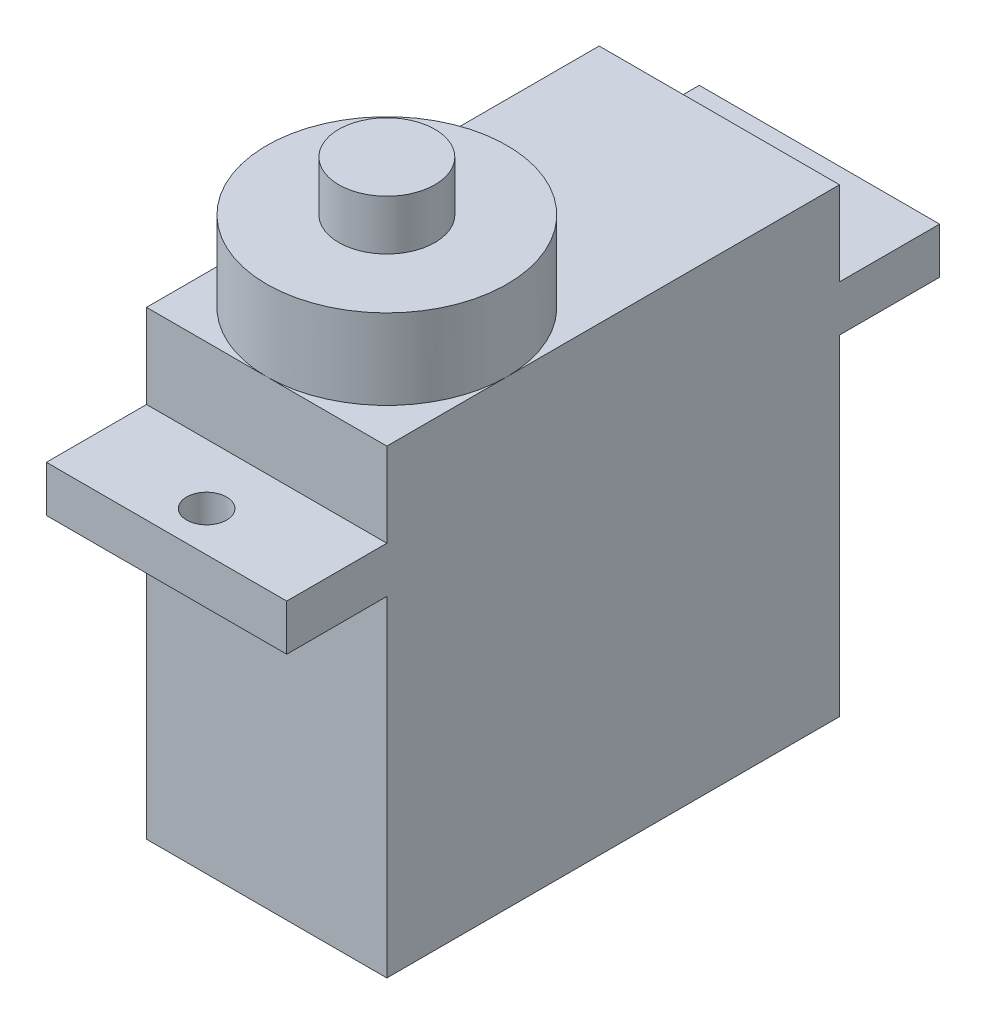
ISO-10303-21;
HEADER;
FILE_DESCRIPTION(('STEP AP214'),'2;1');
FILE_NAME('part.step','',(''),(''),'','','');
FILE_SCHEMA(('AUTOMOTIVE_DESIGN { 1 0 10303 214 1 1 1 1 }'));
ENDSEC;
DATA;
#1=APPLICATION_CONTEXT('core data for automotive mechanical design processes');
#2=APPLICATION_PROTOCOL_DEFINITION('international standard','automotive_design',2000,#1);
#3=PRODUCT_CONTEXT('',#1,'mechanical');
#4=PRODUCT('Part','Part','',(#3));
#5=PRODUCT_RELATED_PRODUCT_CATEGORY('part','',(#4));
#6=PRODUCT_DEFINITION_FORMATION('','',#4);
#7=PRODUCT_DEFINITION_CONTEXT('part definition',#1,'design');
#8=PRODUCT_DEFINITION('design','',#6,#7);
#9=PRODUCT_DEFINITION_SHAPE('','',#8);
#10=(LENGTH_UNIT() NAMED_UNIT(*) SI_UNIT(.MILLI.,.METRE.));
#11=(NAMED_UNIT(*) PLANE_ANGLE_UNIT() SI_UNIT($,.RADIAN.));
#12=(NAMED_UNIT(*) SI_UNIT($,.STERADIAN.) SOLID_ANGLE_UNIT());
#13=UNCERTAINTY_MEASURE_WITH_UNIT(LENGTH_MEASURE(1.E-05),#10,'distance_accuracy_value','');
#14=(GEOMETRIC_REPRESENTATION_CONTEXT(3) GLOBAL_UNCERTAINTY_ASSIGNED_CONTEXT((#13)) GLOBAL_UNIT_ASSIGNED_CONTEXT((#10,
#11,#12)) REPRESENTATION_CONTEXT('',''));
#15=CARTESIAN_POINT('',(0.,0.,0.));
#16=DIRECTION('',(0.,0.,1.));
#17=DIRECTION('',(1.,0.,0.));
#18=AXIS2_PLACEMENT_3D('',#15,#16,#17);
#19=CARTESIAN_POINT('',(12.,0.,-22.6));
#20=DIRECTION('',(0.,0.,1.));
#21=DIRECTION('',(1.,0.,0.));
#22=AXIS2_PLACEMENT_3D('',#19,#20,#21);
#23=PLANE('',#22);
#24=DIRECTION('',(1.,0.,0.));
#25=VECTOR('',#24,1.);
#26=CARTESIAN_POINT('',(0.,18.8,-22.6));
#27=LINE('',#26,#25);
#28=CARTESIAN_POINT('',(0.,18.8,-22.6));
#29=VERTEX_POINT('',#28);
#30=CARTESIAN_POINT('',(12.,18.8,-22.6));
#31=VERTEX_POINT('',#30);
#32=EDGE_CURVE('E60',#29,#31,#27,.T.);
#33=ORIENTED_EDGE('',*,*,#32,.F.);
#34=DIRECTION('',(0.,1.,0.));
#35=VECTOR('',#34,1.);
#36=CARTESIAN_POINT('',(0.,0.,-22.6));
#37=LINE('',#36,#35);
#38=CARTESIAN_POINT('',(0.,23.,-22.6));
#39=VERTEX_POINT('',#38);
#40=EDGE_CURVE('E236',#29,#39,#37,.T.);
#41=ORIENTED_EDGE('',*,*,#40,.T.);
#42=DIRECTION('',(-1.,0.,0.));
#43=VECTOR('',#42,1.);
#44=CARTESIAN_POINT('',(12.,23.,-22.6));
#45=LINE('',#44,#43);
#46=CARTESIAN_POINT('',(12.,23.,-22.6));
#47=VERTEX_POINT('',#46);
#48=EDGE_CURVE('E136',#47,#39,#45,.T.);
#49=ORIENTED_EDGE('',*,*,#48,.F.);
#50=DIRECTION('',(0.,1.,0.));
#51=VECTOR('',#50,1.);
#52=CARTESIAN_POINT('',(12.,0.,-22.6));
#53=LINE('',#52,#51);
#54=EDGE_CURVE('E134',#31,#47,#53,.T.);
#55=ORIENTED_EDGE('',*,*,#54,.F.);
#56=EDGE_LOOP('',(#33,#41,#49,#55));
#57=FACE_BOUND('',#56,.T.);
#58=ADVANCED_FACE('F34',(#57),#23,.F.);
#59=CARTESIAN_POINT('',(12.,0.,0.));
#60=DIRECTION('',(0.,0.,-1.));
#61=DIRECTION('',(-1.,0.,0.));
#62=AXIS2_PLACEMENT_3D('',#59,#60,#61);
#63=PLANE('',#62);
#64=DIRECTION('',(-1.,0.,0.));
#65=VECTOR('',#64,1.);
#66=CARTESIAN_POINT('',(12.,18.8,0.));
#67=LINE('',#66,#65);
#68=CARTESIAN_POINT('',(12.,18.8,0.));
#69=VERTEX_POINT('',#68);
#70=CARTESIAN_POINT('',(0.,18.8,0.));
#71=VERTEX_POINT('',#70);
#72=EDGE_CURVE('E191',#69,#71,#67,.T.);
#73=ORIENTED_EDGE('',*,*,#72,.F.);
#74=DIRECTION('',(0.,-1.,0.));
#75=VECTOR('',#74,1.);
#76=CARTESIAN_POINT('',(12.,0.,0.));
#77=LINE('',#76,#75);
#78=CARTESIAN_POINT('',(12.,23.,0.));
#79=VERTEX_POINT('',#78);
#80=EDGE_CURVE('E224',#79,#69,#77,.T.);
#81=ORIENTED_EDGE('',*,*,#80,.F.);
#82=DIRECTION('',(-1.,0.,0.));
#83=VECTOR('',#82,1.);
#84=CARTESIAN_POINT('',(12.,23.,0.));
#85=LINE('',#84,#83);
#86=CARTESIAN_POINT('',(6.,23.,0.));
#87=VERTEX_POINT('',#86);
#88=EDGE_CURVE('E250',#79,#87,#85,.T.);
#89=ORIENTED_EDGE('',*,*,#88,.T.);
#90=CARTESIAN_POINT('',(0.,23.,0.));
#91=VERTEX_POINT('',#90);
#92=EDGE_CURVE('E252',#87,#91,#85,.T.);
#93=ORIENTED_EDGE('',*,*,#92,.T.);
#94=DIRECTION('',(0.,-1.,0.));
#95=VECTOR('',#94,1.);
#96=CARTESIAN_POINT('',(0.,0.,0.));
#97=LINE('',#96,#95);
#98=EDGE_CURVE('E275',#91,#71,#97,.T.);
#99=ORIENTED_EDGE('',*,*,#98,.T.);
#100=EDGE_LOOP('',(#73,#81,#89,#93,#99));
#101=FACE_BOUND('',#100,.T.);
#102=ADVANCED_FACE('F285',(#101),#63,.F.);
#103=CARTESIAN_POINT('',(12.,23.,0.));
#104=DIRECTION('',(0.,-1.,0.));
#105=DIRECTION('',(0.,0.,-1.));
#106=AXIS2_PLACEMENT_3D('',#103,#104,#105);
#107=PLANE('',#106);
#108=CARTESIAN_POINT('',(6.,23.,-6.));
#109=DIRECTION('',(0.,1.,0.));
#110=DIRECTION('',(0.,0.,1.));
#111=AXIS2_PLACEMENT_3D('',#108,#109,#110);
#112=CIRCLE('',#111,6.);
#113=CARTESIAN_POINT('',(12.,23.,-6.));
#114=VERTEX_POINT('',#113);
#115=EDGE_CURVE('E45',#87,#114,#112,.T.);
#116=ORIENTED_EDGE('',*,*,#115,.F.);
#117=ORIENTED_EDGE('',*,*,#88,.F.);
#118=DIRECTION('',(0.,0.,1.));
#119=VECTOR('',#118,1.);
#120=CARTESIAN_POINT('',(12.,23.,0.));
#121=LINE('',#120,#119);
#122=EDGE_CURVE('E235',#114,#79,#121,.T.);
#123=ORIENTED_EDGE('',*,*,#122,.F.);
#124=EDGE_LOOP('',(#116,#117,#123));
#125=FACE_BOUND('',#124,.T.);
#126=ADVANCED_FACE('F283',(#125),#107,.F.);
#127=CARTESIAN_POINT('',(0.,23.,-6.));
#128=VERTEX_POINT('',#127);
#129=EDGE_CURVE('E11',#114,#128,#112,.T.);
#130=ORIENTED_EDGE('',*,*,#129,.F.);
#131=EDGE_CURVE('E230',#47,#114,#121,.T.);
#132=ORIENTED_EDGE('',*,*,#131,.F.);
#133=ORIENTED_EDGE('',*,*,#48,.T.);
#134=DIRECTION('',(0.,0.,1.));
#135=VECTOR('',#134,1.);
#136=CARTESIAN_POINT('',(0.,23.,0.));
#137=LINE('',#136,#135);
#138=EDGE_CURVE('E245',#39,#128,#137,.T.);
#139=ORIENTED_EDGE('',*,*,#138,.T.);
#140=EDGE_LOOP('',(#130,#132,#133,#139));
#141=FACE_BOUND('',#140,.T.);
#142=ADVANCED_FACE('F277',(#141),#107,.F.);
#143=CARTESIAN_POINT('',(12.,16.5,0.));
#144=VERTEX_POINT('',#143);
#145=CARTESIAN_POINT('',(12.,0.,0.));
#146=VERTEX_POINT('',#145);
#147=EDGE_CURVE('E226',#144,#146,#77,.T.);
#148=ORIENTED_EDGE('',*,*,#147,.F.);
#149=DIRECTION('',(-1.,0.,0.));
#150=VECTOR('',#149,1.);
#151=CARTESIAN_POINT('',(12.,16.5,0.));
#152=LINE('',#151,#150);
#153=CARTESIAN_POINT('',(0.,16.5,0.));
#154=VERTEX_POINT('',#153);
#155=EDGE_CURVE('E202',#144,#154,#152,.T.);
#156=ORIENTED_EDGE('',*,*,#155,.T.);
#157=CARTESIAN_POINT('',(0.,0.,0.));
#158=VERTEX_POINT('',#157);
#159=EDGE_CURVE('E221',#154,#158,#97,.T.);
#160=ORIENTED_EDGE('',*,*,#159,.T.);
#161=DIRECTION('',(-1.,0.,0.));
#162=VECTOR('',#161,1.);
#163=CARTESIAN_POINT('',(12.,0.,0.));
#164=LINE('',#163,#162);
#165=EDGE_CURVE('E256',#146,#158,#164,.T.);
#166=ORIENTED_EDGE('',*,*,#165,.F.);
#167=EDGE_LOOP('',(#148,#156,#160,#166));
#168=FACE_BOUND('',#167,.T.);
#169=ADVANCED_FACE('F36',(#168),#63,.F.);
#170=CARTESIAN_POINT('',(12.,0.,0.));
#171=DIRECTION('',(0.,1.,0.));
#172=DIRECTION('',(0.,0.,1.));
#173=AXIS2_PLACEMENT_3D('',#170,#171,#172);
#174=PLANE('',#173);
#175=DIRECTION('',(0.,0.,-1.));
#176=VECTOR('',#175,1.);
#177=CARTESIAN_POINT('',(0.,0.,0.));
#178=LINE('',#177,#176);
#179=CARTESIAN_POINT('',(0.,0.,-22.6));
#180=VERTEX_POINT('',#179);
#181=EDGE_CURVE('E240',#158,#180,#178,.T.);
#182=ORIENTED_EDGE('',*,*,#181,.T.);
#183=DIRECTION('',(-1.,0.,0.));
#184=VECTOR('',#183,1.);
#185=CARTESIAN_POINT('',(12.,0.,-22.6));
#186=LINE('',#185,#184);
#187=CARTESIAN_POINT('',(12.,0.,-22.6));
#188=VERTEX_POINT('',#187);
#189=EDGE_CURVE('E254',#188,#180,#186,.T.);
#190=ORIENTED_EDGE('',*,*,#189,.F.);
#191=DIRECTION('',(0.,0.,-1.));
#192=VECTOR('',#191,1.);
#193=CARTESIAN_POINT('',(12.,0.,0.));
#194=LINE('',#193,#192);
#195=EDGE_CURVE('E142',#146,#188,#194,.T.);
#196=ORIENTED_EDGE('',*,*,#195,.F.);
#197=ORIENTED_EDGE('',*,*,#165,.T.);
#198=EDGE_LOOP('',(#182,#190,#196,#197));
#199=FACE_BOUND('',#198,.T.);
#200=ADVANCED_FACE('F304',(#199),#174,.F.);
#201=CARTESIAN_POINT('',(0.,16.5,-22.6));
#202=VERTEX_POINT('',#201);
#203=EDGE_CURVE('E239',#180,#202,#37,.T.);
#204=ORIENTED_EDGE('',*,*,#203,.T.);
#205=DIRECTION('',(1.,0.,0.));
#206=VECTOR('',#205,1.);
#207=CARTESIAN_POINT('',(0.,16.5,-22.6));
#208=LINE('',#207,#206);
#209=CARTESIAN_POINT('',(12.,16.5,-22.6));
#210=VERTEX_POINT('',#209);
#211=EDGE_CURVE('E52',#202,#210,#208,.T.);
#212=ORIENTED_EDGE('',*,*,#211,.T.);
#213=EDGE_CURVE('E141',#188,#210,#53,.T.);
#214=ORIENTED_EDGE('',*,*,#213,.F.);
#215=ORIENTED_EDGE('',*,*,#189,.T.);
#216=EDGE_LOOP('',(#204,#212,#214,#215));
#217=FACE_BOUND('',#216,.T.);
#218=ADVANCED_FACE('F306',(#217),#23,.F.);
#219=EDGE_CURVE('E43',#128,#87,#112,.T.);
#220=ORIENTED_EDGE('',*,*,#219,.F.);
#221=EDGE_CURVE('E249',#128,#91,#137,.T.);
#222=ORIENTED_EDGE('',*,*,#221,.T.);
#223=ORIENTED_EDGE('',*,*,#92,.F.);
#224=EDGE_LOOP('',(#220,#222,#223));
#225=FACE_BOUND('',#224,.T.);
#226=ADVANCED_FACE('F269',(#225),#107,.F.);
#227=CARTESIAN_POINT('',(12.,0.,0.));
#228=DIRECTION('',(-1.,0.,0.));
#229=DIRECTION('',(0.,0.,1.));
#230=AXIS2_PLACEMENT_3D('',#227,#228,#229);
#231=PLANE('',#230);
#232=ORIENTED_EDGE('',*,*,#80,.T.);
#233=DIRECTION('',(0.,0.,-1.));
#234=VECTOR('',#233,1.);
#235=CARTESIAN_POINT('',(12.,18.8,0.));
#236=LINE('',#235,#234);
#237=CARTESIAN_POINT('',(12.,18.8,5.));
#238=VERTEX_POINT('',#237);
#239=EDGE_CURVE('E188',#238,#69,#236,.T.);
#240=ORIENTED_EDGE('',*,*,#239,.F.);
#241=DIRECTION('',(0.,-1.,0.));
#242=VECTOR('',#241,1.);
#243=CARTESIAN_POINT('',(12.,18.8,5.));
#244=LINE('',#243,#242);
#245=CARTESIAN_POINT('',(12.,16.5,5.));
#246=VERTEX_POINT('',#245);
#247=EDGE_CURVE('E199',#238,#246,#244,.T.);
#248=ORIENTED_EDGE('',*,*,#247,.T.);
#249=DIRECTION('',(0.,0.,-1.));
#250=VECTOR('',#249,1.);
#251=CARTESIAN_POINT('',(12.,16.5,0.));
#252=LINE('',#251,#250);
#253=EDGE_CURVE('E185',#246,#144,#252,.T.);
#254=ORIENTED_EDGE('',*,*,#253,.T.);
#255=ORIENTED_EDGE('',*,*,#147,.T.);
#256=ORIENTED_EDGE('',*,*,#195,.T.);
#257=ORIENTED_EDGE('',*,*,#213,.T.);
#258=DIRECTION('',(0.,0.,-1.));
#259=VECTOR('',#258,1.);
#260=CARTESIAN_POINT('',(12.,16.5,-22.6));
#261=LINE('',#260,#259);
#262=CARTESIAN_POINT('',(12.,16.5,-27.6));
#263=VERTEX_POINT('',#262);
#264=EDGE_CURVE('E172',#210,#263,#261,.T.);
#265=ORIENTED_EDGE('',*,*,#264,.T.);
#266=DIRECTION('',(0.,-1.,0.));
#267=VECTOR('',#266,1.);
#268=CARTESIAN_POINT('',(12.,18.8,-27.6));
#269=LINE('',#268,#267);
#270=CARTESIAN_POINT('',(12.,18.8,-27.6));
#271=VERTEX_POINT('',#270);
#272=EDGE_CURVE('E156',#271,#263,#269,.T.);
#273=ORIENTED_EDGE('',*,*,#272,.F.);
#274=DIRECTION('',(0.,0.,-1.));
#275=VECTOR('',#274,1.);
#276=CARTESIAN_POINT('',(12.,18.8,-22.6));
#277=LINE('',#276,#275);
#278=EDGE_CURVE('E148',#31,#271,#277,.T.);
#279=ORIENTED_EDGE('',*,*,#278,.F.);
#280=ORIENTED_EDGE('',*,*,#54,.T.);
#281=ORIENTED_EDGE('',*,*,#131,.T.);
#282=ORIENTED_EDGE('',*,*,#122,.T.);
#283=EDGE_LOOP('',(#232,#240,#248,#254,#255,#256,#257,#265,#273,#279,#280,#281,#282));
#284=FACE_BOUND('',#283,.T.);
#285=ADVANCED_FACE('F154',(#284),#231,.F.);
#286=CARTESIAN_POINT('',(0.,0.,0.));
#287=DIRECTION('',(-1.,0.,0.));
#288=DIRECTION('',(0.,0.,1.));
#289=AXIS2_PLACEMENT_3D('',#286,#287,#288);
#290=PLANE('',#289);
#291=ORIENTED_EDGE('',*,*,#98,.F.);
#292=ORIENTED_EDGE('',*,*,#221,.F.);
#293=ORIENTED_EDGE('',*,*,#138,.F.);
#294=ORIENTED_EDGE('',*,*,#40,.F.);
#295=DIRECTION('',(0.,0.,1.));
#296=VECTOR('',#295,1.);
#297=CARTESIAN_POINT('',(0.,18.8,-22.6));
#298=LINE('',#297,#296);
#299=CARTESIAN_POINT('',(0.,18.8,-27.6));
#300=VERTEX_POINT('',#299);
#301=EDGE_CURVE('E151',#300,#29,#298,.T.);
#302=ORIENTED_EDGE('',*,*,#301,.F.);
#303=DIRECTION('',(0.,-1.,0.));
#304=VECTOR('',#303,1.);
#305=CARTESIAN_POINT('',(0.,18.8,-27.6));
#306=LINE('',#305,#304);
#307=CARTESIAN_POINT('',(0.,16.5,-27.6));
#308=VERTEX_POINT('',#307);
#309=EDGE_CURVE('E160',#300,#308,#306,.T.);
#310=ORIENTED_EDGE('',*,*,#309,.T.);
#311=DIRECTION('',(0.,0.,1.));
#312=VECTOR('',#311,1.);
#313=CARTESIAN_POINT('',(0.,16.5,-22.6));
#314=LINE('',#313,#312);
#315=EDGE_CURVE('E173',#308,#202,#314,.T.);
#316=ORIENTED_EDGE('',*,*,#315,.T.);
#317=ORIENTED_EDGE('',*,*,#203,.F.);
#318=ORIENTED_EDGE('',*,*,#181,.F.);
#319=ORIENTED_EDGE('',*,*,#159,.F.);
#320=DIRECTION('',(0.,0.,1.));
#321=VECTOR('',#320,1.);
#322=CARTESIAN_POINT('',(0.,16.5,0.));
#323=LINE('',#322,#321);
#324=CARTESIAN_POINT('',(0.,16.5,5.));
#325=VERTEX_POINT('',#324);
#326=EDGE_CURVE('E205',#154,#325,#323,.T.);
#327=ORIENTED_EDGE('',*,*,#326,.T.);
#328=DIRECTION('',(0.,-1.,0.));
#329=VECTOR('',#328,1.);
#330=CARTESIAN_POINT('',(0.,18.8,5.));
#331=LINE('',#330,#329);
#332=CARTESIAN_POINT('',(0.,18.8,5.));
#333=VERTEX_POINT('',#332);
#334=EDGE_CURVE('E210',#333,#325,#331,.T.);
#335=ORIENTED_EDGE('',*,*,#334,.F.);
#336=DIRECTION('',(0.,0.,1.));
#337=VECTOR('',#336,1.);
#338=CARTESIAN_POINT('',(0.,18.8,0.));
#339=LINE('',#338,#337);
#340=EDGE_CURVE('E195',#71,#333,#339,.T.);
#341=ORIENTED_EDGE('',*,*,#340,.F.);
#342=EDGE_LOOP('',(#291,#292,#293,#294,#302,#310,#316,#317,#318,#319,#327,#335,#341));
#343=FACE_BOUND('',#342,.T.);
#344=ADVANCED_FACE('F273',(#343),#290,.T.);
#345=CARTESIAN_POINT('',(6.,27.,-6.));
#346=DIRECTION('',(0.,-1.,0.));
#347=DIRECTION('',(0.,0.,-1.));
#348=AXIS2_PLACEMENT_3D('',#345,#346,#347);
#349=CYLINDRICAL_SURFACE('',#348,6.);
#350=CARTESIAN_POINT('',(6.,27.,-6.));
#351=DIRECTION('',(0.,1.,0.));
#352=DIRECTION('',(0.,0.,1.));
#353=AXIS2_PLACEMENT_3D('',#350,#351,#352);
#354=CIRCLE('',#353,6.);
#355=CARTESIAN_POINT('',(6.,27.,0.));
#356=VERTEX_POINT('',#355);
#357=EDGE_CURVE('E219',#356,#356,#354,.T.);
#358=ORIENTED_EDGE('',*,*,#357,.F.);
#359=EDGE_LOOP('',(#358));
#360=FACE_BOUND('',#359,.T.);
#361=ORIENTED_EDGE('',*,*,#115,.T.);
#362=ORIENTED_EDGE('',*,*,#129,.T.);
#363=ORIENTED_EDGE('',*,*,#219,.T.);
#364=EDGE_LOOP('',(#361,#362,#363));
#365=FACE_BOUND('',#364,.T.);
#366=ADVANCED_FACE('F263',(#360,#365),#349,.T.);
#367=CARTESIAN_POINT('',(6.,27.,-6.));
#368=DIRECTION('',(0.,1.,0.));
#369=DIRECTION('',(0.,0.,1.));
#370=AXIS2_PLACEMENT_3D('',#367,#368,#369);
#371=PLANE('',#370);
#372=CARTESIAN_POINT('',(6.,27.,-6.));
#373=DIRECTION('',(0.,1.,0.));
#374=DIRECTION('',(0.,0.,1.));
#375=AXIS2_PLACEMENT_3D('',#372,#373,#374);
#376=CIRCLE('',#375,2.4);
#377=CARTESIAN_POINT('',(6.,27.,-3.6));
#378=VERTEX_POINT('',#377);
#379=EDGE_CURVE('E213',#378,#378,#376,.T.);
#380=ORIENTED_EDGE('',*,*,#379,.F.);
#381=EDGE_LOOP('',(#380));
#382=FACE_BOUND('',#381,.T.);
#383=ORIENTED_EDGE('',*,*,#357,.T.);
#384=EDGE_LOOP('',(#383));
#385=FACE_BOUND('',#384,.T.);
#386=ADVANCED_FACE('F364',(#382,#385),#371,.T.);
#387=CARTESIAN_POINT('',(6.,29.5,-6.));
#388=DIRECTION('',(0.,-1.,0.));
#389=DIRECTION('',(0.,0.,-1.));
#390=AXIS2_PLACEMENT_3D('',#387,#388,#389);
#391=CYLINDRICAL_SURFACE('',#390,2.4);
#392=CARTESIAN_POINT('',(6.,29.5,-6.));
#393=DIRECTION('',(0.,1.,0.));
#394=DIRECTION('',(0.,0.,1.));
#395=AXIS2_PLACEMENT_3D('',#392,#393,#394);
#396=CIRCLE('',#395,2.4);
#397=CARTESIAN_POINT('',(6.,29.5,-3.6));
#398=VERTEX_POINT('',#397);
#399=EDGE_CURVE('E214',#398,#398,#396,.T.);
#400=ORIENTED_EDGE('',*,*,#399,.F.);
#401=EDGE_LOOP('',(#400));
#402=FACE_BOUND('',#401,.T.);
#403=ORIENTED_EDGE('',*,*,#379,.T.);
#404=EDGE_LOOP('',(#403));
#405=FACE_BOUND('',#404,.T.);
#406=ADVANCED_FACE('F368',(#402,#405),#391,.T.);
#407=CARTESIAN_POINT('',(6.,29.5,-6.));
#408=DIRECTION('',(0.,1.,0.));
#409=DIRECTION('',(0.,0.,1.));
#410=AXIS2_PLACEMENT_3D('',#407,#408,#409);
#411=PLANE('',#410);
#412=ORIENTED_EDGE('',*,*,#399,.T.);
#413=EDGE_LOOP('',(#412));
#414=FACE_BOUND('',#413,.T.);
#415=ADVANCED_FACE('F372',(#414),#411,.T.);
#416=CARTESIAN_POINT('',(0.,18.8,0.));
#417=DIRECTION('',(0.,-1.,0.));
#418=DIRECTION('',(0.,0.,-1.));
#419=AXIS2_PLACEMENT_3D('',#416,#417,#418);
#420=PLANE('',#419);
#421=ORIENTED_EDGE('',*,*,#239,.T.);
#422=ORIENTED_EDGE('',*,*,#72,.T.);
#423=ORIENTED_EDGE('',*,*,#340,.T.);
#424=DIRECTION('',(1.,0.,0.));
#425=VECTOR('',#424,1.);
#426=CARTESIAN_POINT('',(12.,18.8,5.));
#427=LINE('',#426,#425);
#428=EDGE_CURVE('E197',#333,#238,#427,.T.);
#429=ORIENTED_EDGE('',*,*,#428,.T.);
#430=EDGE_LOOP('',(#421,#422,#423,#429));
#431=FACE_BOUND('',#430,.T.);
#432=CARTESIAN_POINT('',(6.,18.8,3.));
#433=DIRECTION('',(0.,1.,0.));
#434=DIRECTION('',(0.,0.,1.));
#435=AXIS2_PLACEMENT_3D('',#432,#433,#434);
#436=CIRCLE('',#435,1.);
#437=CARTESIAN_POINT('',(6.,18.8,4.));
#438=VERTEX_POINT('',#437);
#439=EDGE_CURVE('E182',#438,#438,#436,.T.);
#440=ORIENTED_EDGE('',*,*,#439,.F.);
#441=EDGE_LOOP('',(#440));
#442=FACE_BOUND('',#441,.T.);
#443=ADVANCED_FACE('F287',(#431,#442),#420,.F.);
#444=CARTESIAN_POINT('',(0.,16.5,0.));
#445=DIRECTION('',(0.,-1.,0.));
#446=DIRECTION('',(0.,0.,-1.));
#447=AXIS2_PLACEMENT_3D('',#444,#445,#446);
#448=PLANE('',#447);
#449=ORIENTED_EDGE('',*,*,#253,.F.);
#450=DIRECTION('',(1.,0.,0.));
#451=VECTOR('',#450,1.);
#452=CARTESIAN_POINT('',(12.,16.5,5.));
#453=LINE('',#452,#451);
#454=EDGE_CURVE('E192',#325,#246,#453,.T.);
#455=ORIENTED_EDGE('',*,*,#454,.F.);
#456=ORIENTED_EDGE('',*,*,#326,.F.);
#457=ORIENTED_EDGE('',*,*,#155,.F.);
#458=EDGE_LOOP('',(#449,#455,#456,#457));
#459=FACE_BOUND('',#458,.T.);
#460=CARTESIAN_POINT('',(6.,16.5,3.));
#461=DIRECTION('',(0.,1.,0.));
#462=DIRECTION('',(0.,0.,1.));
#463=AXIS2_PLACEMENT_3D('',#460,#461,#462);
#464=CIRCLE('',#463,1.);
#465=CARTESIAN_POINT('',(6.,16.5,4.));
#466=VERTEX_POINT('',#465);
#467=EDGE_CURVE('E181',#466,#466,#464,.T.);
#468=ORIENTED_EDGE('',*,*,#467,.T.);
#469=EDGE_LOOP('',(#468));
#470=FACE_BOUND('',#469,.T.);
#471=ADVANCED_FACE('F299',(#459,#470),#448,.T.);
#472=CARTESIAN_POINT('',(12.,18.8,5.));
#473=DIRECTION('',(0.,0.,-1.));
#474=DIRECTION('',(-1.,0.,0.));
#475=AXIS2_PLACEMENT_3D('',#472,#473,#474);
#476=PLANE('',#475);
#477=ORIENTED_EDGE('',*,*,#454,.T.);
#478=ORIENTED_EDGE('',*,*,#247,.F.);
#479=ORIENTED_EDGE('',*,*,#428,.F.);
#480=ORIENTED_EDGE('',*,*,#334,.T.);
#481=EDGE_LOOP('',(#477,#478,#479,#480));
#482=FACE_BOUND('',#481,.T.);
#483=ADVANCED_FACE('F295',(#482),#476,.F.);
#484=CARTESIAN_POINT('',(6.,18.8,3.));
#485=DIRECTION('',(0.,-1.,0.));
#486=DIRECTION('',(0.,0.,-1.));
#487=AXIS2_PLACEMENT_3D('',#484,#485,#486);
#488=CYLINDRICAL_SURFACE('',#487,1.);
#489=ORIENTED_EDGE('',*,*,#439,.T.);
#490=EDGE_LOOP('',(#489));
#491=FACE_BOUND('',#490,.T.);
#492=ORIENTED_EDGE('',*,*,#467,.F.);
#493=EDGE_LOOP('',(#492));
#494=FACE_BOUND('',#493,.T.);
#495=ADVANCED_FACE('F379',(#491,#494),#488,.F.);
#496=CARTESIAN_POINT('',(0.,18.8,0.));
#497=DIRECTION('',(0.,-1.,0.));
#498=DIRECTION('',(0.,0.,-1.));
#499=AXIS2_PLACEMENT_3D('',#496,#497,#498);
#500=PLANE('',#499);
#501=ORIENTED_EDGE('',*,*,#301,.T.);
#502=ORIENTED_EDGE('',*,*,#32,.T.);
#503=ORIENTED_EDGE('',*,*,#278,.T.);
#504=DIRECTION('',(-1.,0.,0.));
#505=VECTOR('',#504,1.);
#506=CARTESIAN_POINT('',(0.,18.8,-27.6));
#507=LINE('',#506,#505);
#508=EDGE_CURVE('E158',#271,#300,#507,.T.);
#509=ORIENTED_EDGE('',*,*,#508,.T.);
#510=EDGE_LOOP('',(#501,#502,#503,#509));
#511=FACE_BOUND('',#510,.T.);
#512=CARTESIAN_POINT('',(6.,18.8,-25.6));
#513=DIRECTION('',(0.,1.,0.));
#514=DIRECTION('',(0.,0.,1.));
#515=AXIS2_PLACEMENT_3D('',#512,#513,#514);
#516=CIRCLE('',#515,1.);
#517=CARTESIAN_POINT('',(6.,18.8,-24.6));
#518=VERTEX_POINT('',#517);
#519=EDGE_CURVE('E318',#518,#518,#516,.T.);
#520=ORIENTED_EDGE('',*,*,#519,.F.);
#521=EDGE_LOOP('',(#520));
#522=FACE_BOUND('',#521,.T.);
#523=ADVANCED_FACE('F146',(#511,#522),#500,.F.);
#524=CARTESIAN_POINT('',(0.,16.5,0.));
#525=DIRECTION('',(0.,-1.,0.));
#526=DIRECTION('',(0.,0.,-1.));
#527=AXIS2_PLACEMENT_3D('',#524,#525,#526);
#528=PLANE('',#527);
#529=ORIENTED_EDGE('',*,*,#315,.F.);
#530=DIRECTION('',(-1.,0.,0.));
#531=VECTOR('',#530,1.);
#532=CARTESIAN_POINT('',(0.,16.5,-27.6));
#533=LINE('',#532,#531);
#534=EDGE_CURVE('E167',#263,#308,#533,.T.);
#535=ORIENTED_EDGE('',*,*,#534,.F.);
#536=ORIENTED_EDGE('',*,*,#264,.F.);
#537=ORIENTED_EDGE('',*,*,#211,.F.);
#538=EDGE_LOOP('',(#529,#535,#536,#537));
#539=FACE_BOUND('',#538,.T.);
#540=CARTESIAN_POINT('',(6.,16.5,-25.6));
#541=DIRECTION('',(0.,1.,0.));
#542=DIRECTION('',(0.,0.,1.));
#543=AXIS2_PLACEMENT_3D('',#540,#541,#542);
#544=CIRCLE('',#543,1.);
#545=CARTESIAN_POINT('',(6.,16.5,-24.6));
#546=VERTEX_POINT('',#545);
#547=EDGE_CURVE('E320',#546,#546,#544,.T.);
#548=ORIENTED_EDGE('',*,*,#547,.T.);
#549=EDGE_LOOP('',(#548));
#550=FACE_BOUND('',#549,.T.);
#551=ADVANCED_FACE('F311',(#539,#550),#528,.T.);
#552=CARTESIAN_POINT('',(0.,18.8,-27.6));
#553=DIRECTION('',(0.,0.,1.));
#554=DIRECTION('',(1.,0.,0.));
#555=AXIS2_PLACEMENT_3D('',#552,#553,#554);
#556=PLANE('',#555);
#557=ORIENTED_EDGE('',*,*,#534,.T.);
#558=ORIENTED_EDGE('',*,*,#309,.F.);
#559=ORIENTED_EDGE('',*,*,#508,.F.);
#560=ORIENTED_EDGE('',*,*,#272,.T.);
#561=EDGE_LOOP('',(#557,#558,#559,#560));
#562=FACE_BOUND('',#561,.T.);
#563=ADVANCED_FACE('F317',(#562),#556,.F.);
#564=CARTESIAN_POINT('',(6.,18.8,-25.6));
#565=DIRECTION('',(0.,-1.,0.));
#566=DIRECTION('',(0.,0.,-1.));
#567=AXIS2_PLACEMENT_3D('',#564,#565,#566);
#568=CYLINDRICAL_SURFACE('',#567,1.);
#569=ORIENTED_EDGE('',*,*,#519,.T.);
#570=EDGE_LOOP('',(#569));
#571=FACE_BOUND('',#570,.T.);
#572=ORIENTED_EDGE('',*,*,#547,.F.);
#573=EDGE_LOOP('',(#572));
#574=FACE_BOUND('',#573,.T.);
#575=ADVANCED_FACE('F329',(#571,#574),#568,.F.);
#576=CLOSED_SHELL('',(#58,#102,#126,#142,#169,#200,#218,#226,#285,#344,#366,#386,#406,#415,#443,
#471,#483,#495,#523,#551,#563,#575));
#577=MANIFOLD_SOLID_BREP('B2',#576);
#578=ADVANCED_BREP_SHAPE_REPRESENTATION('',(#18,#577),#14);
#579=SHAPE_DEFINITION_REPRESENTATION(#9,#578);
ENDSEC;
END-ISO-10303-21;
